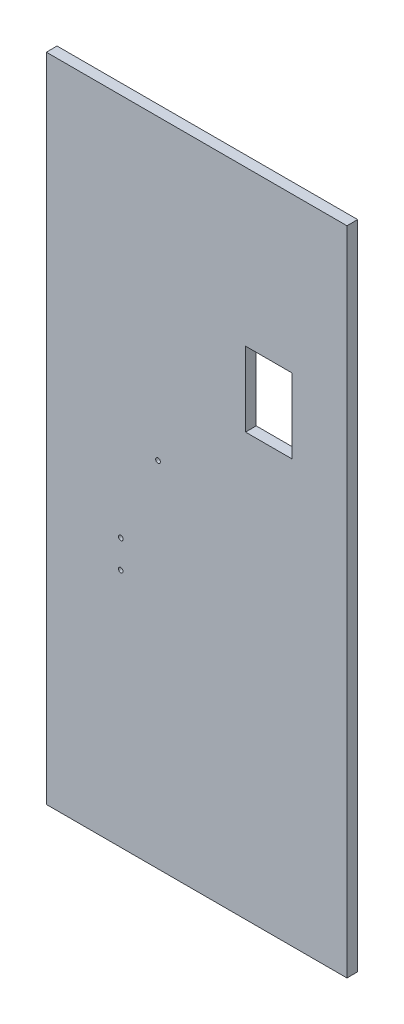
ISO-10303-21;
HEADER;
FILE_DESCRIPTION(('STEP AP214'),'2;1');
FILE_NAME('part.step','',(''),(''),'','','');
FILE_SCHEMA(('AUTOMOTIVE_DESIGN { 1 0 10303 214 1 1 1 1 }'));
ENDSEC;
DATA;
#1=APPLICATION_CONTEXT('core data for automotive mechanical design processes');
#2=APPLICATION_PROTOCOL_DEFINITION('international standard','automotive_design',2000,#1);
#3=PRODUCT_CONTEXT('',#1,'mechanical');
#4=PRODUCT('Part','Part','',(#3));
#5=PRODUCT_RELATED_PRODUCT_CATEGORY('part','',(#4));
#6=PRODUCT_DEFINITION_FORMATION('','',#4);
#7=PRODUCT_DEFINITION_CONTEXT('part definition',#1,'design');
#8=PRODUCT_DEFINITION('design','',#6,#7);
#9=PRODUCT_DEFINITION_SHAPE('','',#8);
#10=(LENGTH_UNIT() NAMED_UNIT(*) SI_UNIT(.MILLI.,.METRE.));
#11=(NAMED_UNIT(*) PLANE_ANGLE_UNIT() SI_UNIT($,.RADIAN.));
#12=(NAMED_UNIT(*) SI_UNIT($,.STERADIAN.) SOLID_ANGLE_UNIT());
#13=UNCERTAINTY_MEASURE_WITH_UNIT(LENGTH_MEASURE(1.E-05),#10,'distance_accuracy_value','');
#14=(GEOMETRIC_REPRESENTATION_CONTEXT(3) GLOBAL_UNCERTAINTY_ASSIGNED_CONTEXT((#13)) GLOBAL_UNIT_ASSIGNED_CONTEXT((#10,
#11,#12)) REPRESENTATION_CONTEXT('',''));
#15=CARTESIAN_POINT('',(0.,0.,0.));
#16=DIRECTION('',(0.,0.,1.));
#17=DIRECTION('',(1.,0.,0.));
#18=AXIS2_PLACEMENT_3D('',#15,#16,#17);
#19=CARTESIAN_POINT('',(0.,-350.,11.5));
#20=DIRECTION('',(0.,1.,0.));
#21=DIRECTION('',(-1.,0.,0.));
#22=AXIS2_PLACEMENT_3D('',#19,#20,#21);
#23=PLANE('',#22);
#24=DIRECTION('',(1.,0.,0.));
#25=VECTOR('',#24,1.);
#26=CARTESIAN_POINT('',(0.,-350.,0.));
#27=LINE('',#26,#25);
#28=CARTESIAN_POINT('',(-161.5,-350.,0.));
#29=VERTEX_POINT('',#28);
#30=CARTESIAN_POINT('',(161.5,-350.,0.));
#31=VERTEX_POINT('',#30);
#32=EDGE_CURVE('E150',#29,#31,#27,.T.);
#33=ORIENTED_EDGE('',*,*,#32,.T.);
#34=DIRECTION('',(0.,0.,-1.));
#35=VECTOR('',#34,1.);
#36=CARTESIAN_POINT('',(161.5,-350.,11.5));
#37=LINE('',#36,#35);
#38=CARTESIAN_POINT('',(161.5,-350.,11.5));
#39=VERTEX_POINT('',#38);
#40=EDGE_CURVE('E11',#39,#31,#37,.T.);
#41=ORIENTED_EDGE('',*,*,#40,.F.);
#42=DIRECTION('',(1.,0.,0.));
#43=VECTOR('',#42,1.);
#44=CARTESIAN_POINT('',(0.,-350.,11.5));
#45=LINE('',#44,#43);
#46=CARTESIAN_POINT('',(-161.5,-350.,11.5));
#47=VERTEX_POINT('',#46);
#48=EDGE_CURVE('E113',#47,#39,#45,.T.);
#49=ORIENTED_EDGE('',*,*,#48,.F.);
#50=DIRECTION('',(0.,0.,-1.));
#51=VECTOR('',#50,1.);
#52=CARTESIAN_POINT('',(-161.5,-350.,11.5));
#53=LINE('',#52,#51);
#54=EDGE_CURVE('E52',#47,#29,#53,.T.);
#55=ORIENTED_EDGE('',*,*,#54,.T.);
#56=EDGE_LOOP('',(#33,#41,#49,#55));
#57=FACE_BOUND('',#56,.T.);
#58=ADVANCED_FACE('F33',(#57),#23,.F.);
#59=CARTESIAN_POINT('',(161.5,0.,11.5));
#60=DIRECTION('',(-1.,0.,0.));
#61=DIRECTION('',(0.,0.,1.));
#62=AXIS2_PLACEMENT_3D('',#59,#60,#61);
#63=PLANE('',#62);
#64=DIRECTION('',(0.,1.,0.));
#65=VECTOR('',#64,1.);
#66=CARTESIAN_POINT('',(161.5,0.,0.));
#67=LINE('',#66,#65);
#68=CARTESIAN_POINT('',(161.5,350.,0.));
#69=VERTEX_POINT('',#68);
#70=EDGE_CURVE('E119',#31,#69,#67,.T.);
#71=ORIENTED_EDGE('',*,*,#70,.T.);
#72=DIRECTION('',(0.,0.,-1.));
#73=VECTOR('',#72,1.);
#74=CARTESIAN_POINT('',(161.5,350.,11.5));
#75=LINE('',#74,#73);
#76=CARTESIAN_POINT('',(161.5,350.,11.5));
#77=VERTEX_POINT('',#76);
#78=EDGE_CURVE('E43',#77,#69,#75,.T.);
#79=ORIENTED_EDGE('',*,*,#78,.F.);
#80=DIRECTION('',(0.,1.,0.));
#81=VECTOR('',#80,1.);
#82=CARTESIAN_POINT('',(161.5,0.,11.5));
#83=LINE('',#82,#81);
#84=EDGE_CURVE('E106',#39,#77,#83,.T.);
#85=ORIENTED_EDGE('',*,*,#84,.F.);
#86=ORIENTED_EDGE('',*,*,#40,.T.);
#87=EDGE_LOOP('',(#71,#79,#85,#86));
#88=FACE_BOUND('',#87,.T.);
#89=ADVANCED_FACE('F118',(#88),#63,.F.);
#90=CARTESIAN_POINT('',(0.,350.,11.5));
#91=DIRECTION('',(0.,1.,0.));
#92=DIRECTION('',(0.,0.,1.));
#93=AXIS2_PLACEMENT_3D('',#90,#91,#92);
#94=PLANE('',#93);
#95=DIRECTION('',(1.,0.,0.));
#96=VECTOR('',#95,1.);
#97=CARTESIAN_POINT('',(0.,350.,0.));
#98=LINE('',#97,#96);
#99=CARTESIAN_POINT('',(-161.5,350.,0.));
#100=VERTEX_POINT('',#99);
#101=EDGE_CURVE('E153',#100,#69,#98,.T.);
#102=ORIENTED_EDGE('',*,*,#101,.F.);
#103=DIRECTION('',(0.,0.,-1.));
#104=VECTOR('',#103,1.);
#105=CARTESIAN_POINT('',(-161.5,350.,11.5));
#106=LINE('',#105,#104);
#107=CARTESIAN_POINT('',(-161.5,350.,11.5));
#108=VERTEX_POINT('',#107);
#109=EDGE_CURVE('E78',#108,#100,#106,.T.);
#110=ORIENTED_EDGE('',*,*,#109,.F.);
#111=DIRECTION('',(1.,0.,0.));
#112=VECTOR('',#111,1.);
#113=CARTESIAN_POINT('',(0.,350.,11.5));
#114=LINE('',#113,#112);
#115=EDGE_CURVE('E112',#108,#77,#114,.T.);
#116=ORIENTED_EDGE('',*,*,#115,.T.);
#117=ORIENTED_EDGE('',*,*,#78,.T.);
#118=EDGE_LOOP('',(#102,#110,#116,#117));
#119=FACE_BOUND('',#118,.T.);
#120=ADVANCED_FACE('F123',(#119),#94,.T.);
#121=CARTESIAN_POINT('',(52.5,0.,11.5));
#122=DIRECTION('',(1.,0.,0.));
#123=DIRECTION('',(0.,0.,-1.));
#124=AXIS2_PLACEMENT_3D('',#121,#122,#123);
#125=PLANE('',#124);
#126=DIRECTION('',(0.,-1.,0.));
#127=VECTOR('',#126,1.);
#128=CARTESIAN_POINT('',(52.5,0.,0.));
#129=LINE('',#128,#127);
#130=CARTESIAN_POINT('',(52.5,183.5,0.));
#131=VERTEX_POINT('',#130);
#132=CARTESIAN_POINT('',(52.5,103.5,0.));
#133=VERTEX_POINT('',#132);
#134=EDGE_CURVE('E139',#131,#133,#129,.T.);
#135=ORIENTED_EDGE('',*,*,#134,.F.);
#136=DIRECTION('',(0.,0.,-1.));
#137=VECTOR('',#136,1.);
#138=CARTESIAN_POINT('',(52.5,183.5,11.5));
#139=LINE('',#138,#137);
#140=CARTESIAN_POINT('',(52.5,183.5,11.5));
#141=VERTEX_POINT('',#140);
#142=EDGE_CURVE('E37',#141,#131,#139,.T.);
#143=ORIENTED_EDGE('',*,*,#142,.F.);
#144=DIRECTION('',(0.,-1.,0.));
#145=VECTOR('',#144,1.);
#146=CARTESIAN_POINT('',(52.5,0.,11.5));
#147=LINE('',#146,#145);
#148=CARTESIAN_POINT('',(52.5,103.5,11.5));
#149=VERTEX_POINT('',#148);
#150=EDGE_CURVE('E167',#141,#149,#147,.T.);
#151=ORIENTED_EDGE('',*,*,#150,.T.);
#152=DIRECTION('',(0.,0.,-1.));
#153=VECTOR('',#152,1.);
#154=CARTESIAN_POINT('',(52.5,103.5,11.5));
#155=LINE('',#154,#153);
#156=EDGE_CURVE('E138',#149,#133,#155,.T.);
#157=ORIENTED_EDGE('',*,*,#156,.T.);
#158=EDGE_LOOP('',(#135,#143,#151,#157));
#159=FACE_BOUND('',#158,.T.);
#160=ADVANCED_FACE('F35',(#159),#125,.T.);
#161=CARTESIAN_POINT('',(0.,183.5,11.5));
#162=DIRECTION('',(0.,1.,0.));
#163=DIRECTION('',(0.,0.,1.));
#164=AXIS2_PLACEMENT_3D('',#161,#162,#163);
#165=PLANE('',#164);
#166=DIRECTION('',(1.,0.,0.));
#167=VECTOR('',#166,1.);
#168=CARTESIAN_POINT('',(0.,183.5,0.));
#169=LINE('',#168,#167);
#170=CARTESIAN_POINT('',(102.5,183.5,0.));
#171=VERTEX_POINT('',#170);
#172=EDGE_CURVE('E142',#131,#171,#169,.T.);
#173=ORIENTED_EDGE('',*,*,#172,.T.);
#174=DIRECTION('',(0.,0.,-1.));
#175=VECTOR('',#174,1.);
#176=CARTESIAN_POINT('',(102.5,183.5,11.5));
#177=LINE('',#176,#175);
#178=CARTESIAN_POINT('',(102.5,183.5,11.5));
#179=VERTEX_POINT('',#178);
#180=EDGE_CURVE('E172',#179,#171,#177,.T.);
#181=ORIENTED_EDGE('',*,*,#180,.F.);
#182=DIRECTION('',(1.,0.,0.));
#183=VECTOR('',#182,1.);
#184=CARTESIAN_POINT('',(0.,183.5,11.5));
#185=LINE('',#184,#183);
#186=EDGE_CURVE('E181',#141,#179,#185,.T.);
#187=ORIENTED_EDGE('',*,*,#186,.F.);
#188=ORIENTED_EDGE('',*,*,#142,.T.);
#189=EDGE_LOOP('',(#173,#181,#187,#188));
#190=FACE_BOUND('',#189,.T.);
#191=ADVANCED_FACE('F180',(#190),#165,.F.);
#192=CARTESIAN_POINT('',(102.5,0.,11.5));
#193=DIRECTION('',(1.,0.,0.));
#194=DIRECTION('',(0.,0.,-1.));
#195=AXIS2_PLACEMENT_3D('',#192,#193,#194);
#196=PLANE('',#195);
#197=DIRECTION('',(0.,-1.,0.));
#198=VECTOR('',#197,1.);
#199=CARTESIAN_POINT('',(102.5,0.,0.));
#200=LINE('',#199,#198);
#201=CARTESIAN_POINT('',(102.5,103.5,0.));
#202=VERTEX_POINT('',#201);
#203=EDGE_CURVE('E144',#171,#202,#200,.T.);
#204=ORIENTED_EDGE('',*,*,#203,.T.);
#205=DIRECTION('',(0.,0.,-1.));
#206=VECTOR('',#205,1.);
#207=CARTESIAN_POINT('',(102.5,103.5,11.5));
#208=LINE('',#207,#206);
#209=CARTESIAN_POINT('',(102.5,103.5,11.5));
#210=VERTEX_POINT('',#209);
#211=EDGE_CURVE('E171',#210,#202,#208,.T.);
#212=ORIENTED_EDGE('',*,*,#211,.F.);
#213=DIRECTION('',(0.,-1.,0.));
#214=VECTOR('',#213,1.);
#215=CARTESIAN_POINT('',(102.5,0.,11.5));
#216=LINE('',#215,#214);
#217=EDGE_CURVE('E301',#179,#210,#216,.T.);
#218=ORIENTED_EDGE('',*,*,#217,.F.);
#219=ORIENTED_EDGE('',*,*,#180,.T.);
#220=EDGE_LOOP('',(#204,#212,#218,#219));
#221=FACE_BOUND('',#220,.T.);
#222=ADVANCED_FACE('F193',(#221),#196,.F.);
#223=CARTESIAN_POINT('',(-81.5,-92.,11.5));
#224=DIRECTION('',(0.,0.,-1.));
#225=DIRECTION('',(-1.,0.,0.));
#226=AXIS2_PLACEMENT_3D('',#223,#224,#225);
#227=CYLINDRICAL_SURFACE('',#226,2.50000000000001);
#228=CARTESIAN_POINT('',(-81.5,-92.,11.5));
#229=DIRECTION('',(0.,0.,1.));
#230=DIRECTION('',(1.,0.,0.));
#231=AXIS2_PLACEMENT_3D('',#228,#229,#230);
#232=CIRCLE('',#231,2.50000000000001);
#233=CARTESIAN_POINT('',(-79.,-92.,11.5));
#234=VERTEX_POINT('',#233);
#235=EDGE_CURVE('E132',#234,#234,#232,.T.);
#236=ORIENTED_EDGE('',*,*,#235,.T.);
#237=EDGE_LOOP('',(#236));
#238=FACE_BOUND('',#237,.T.);
#239=CARTESIAN_POINT('',(-81.5,-92.,0.));
#240=DIRECTION('',(0.,0.,1.));
#241=DIRECTION('',(1.,0.,0.));
#242=AXIS2_PLACEMENT_3D('',#239,#240,#241);
#243=CIRCLE('',#242,2.50000000000001);
#244=CARTESIAN_POINT('',(-79.,-92.,0.));
#245=VERTEX_POINT('',#244);
#246=EDGE_CURVE('E161',#245,#245,#243,.T.);
#247=ORIENTED_EDGE('',*,*,#246,.F.);
#248=EDGE_LOOP('',(#247));
#249=FACE_BOUND('',#248,.T.);
#250=ADVANCED_FACE('F195',(#238,#249),#227,.F.);
#251=CARTESIAN_POINT('',(-81.5,-62.0000000000001,11.5));
#252=DIRECTION('',(0.,0.,-1.));
#253=DIRECTION('',(-1.,0.,0.));
#254=AXIS2_PLACEMENT_3D('',#251,#252,#253);
#255=CYLINDRICAL_SURFACE('',#254,2.5);
#256=CARTESIAN_POINT('',(-81.5,-62.0000000000001,11.5));
#257=DIRECTION('',(0.,0.,1.));
#258=DIRECTION('',(1.,0.,0.));
#259=AXIS2_PLACEMENT_3D('',#256,#257,#258);
#260=CIRCLE('',#259,2.5);
#261=CARTESIAN_POINT('',(-79.,-62.0000000000001,11.5));
#262=VERTEX_POINT('',#261);
#263=EDGE_CURVE('E126',#262,#262,#260,.T.);
#264=ORIENTED_EDGE('',*,*,#263,.T.);
#265=EDGE_LOOP('',(#264));
#266=FACE_BOUND('',#265,.T.);
#267=CARTESIAN_POINT('',(-81.5,-62.0000000000001,0.));
#268=DIRECTION('',(0.,0.,1.));
#269=DIRECTION('',(1.,0.,0.));
#270=AXIS2_PLACEMENT_3D('',#267,#268,#269);
#271=CIRCLE('',#270,2.5);
#272=CARTESIAN_POINT('',(-79.,-62.0000000000001,0.));
#273=VERTEX_POINT('',#272);
#274=EDGE_CURVE('E158',#273,#273,#271,.T.);
#275=ORIENTED_EDGE('',*,*,#274,.F.);
#276=EDGE_LOOP('',(#275));
#277=FACE_BOUND('',#276,.T.);
#278=ADVANCED_FACE('F201',(#266,#277),#255,.F.);
#279=CARTESIAN_POINT('',(-161.5,0.,11.5));
#280=DIRECTION('',(-1.,0.,0.));
#281=DIRECTION('',(0.,0.,1.));
#282=AXIS2_PLACEMENT_3D('',#279,#280,#281);
#283=PLANE('',#282);
#284=DIRECTION('',(0.,1.,0.));
#285=VECTOR('',#284,1.);
#286=CARTESIAN_POINT('',(-161.5,0.,0.));
#287=LINE('',#286,#285);
#288=EDGE_CURVE('E155',#29,#100,#287,.T.);
#289=ORIENTED_EDGE('',*,*,#288,.F.);
#290=ORIENTED_EDGE('',*,*,#54,.F.);
#291=DIRECTION('',(0.,1.,0.));
#292=VECTOR('',#291,1.);
#293=CARTESIAN_POINT('',(-161.5,0.,11.5));
#294=LINE('',#293,#292);
#295=EDGE_CURVE('E124',#47,#108,#294,.T.);
#296=ORIENTED_EDGE('',*,*,#295,.T.);
#297=ORIENTED_EDGE('',*,*,#109,.T.);
#298=EDGE_LOOP('',(#289,#290,#296,#297));
#299=FACE_BOUND('',#298,.T.);
#300=ADVANCED_FACE('F214',(#299),#283,.T.);
#301=CARTESIAN_POINT('',(0.,103.5,11.5));
#302=DIRECTION('',(0.,1.,0.));
#303=DIRECTION('',(0.,0.,1.));
#304=AXIS2_PLACEMENT_3D('',#301,#302,#303);
#305=PLANE('',#304);
#306=DIRECTION('',(1.,0.,0.));
#307=VECTOR('',#306,1.);
#308=CARTESIAN_POINT('',(0.,103.5,0.));
#309=LINE('',#308,#307);
#310=EDGE_CURVE('E147',#133,#202,#309,.T.);
#311=ORIENTED_EDGE('',*,*,#310,.F.);
#312=ORIENTED_EDGE('',*,*,#156,.F.);
#313=DIRECTION('',(1.,0.,0.));
#314=VECTOR('',#313,1.);
#315=CARTESIAN_POINT('',(0.,103.5,11.5));
#316=LINE('',#315,#314);
#317=EDGE_CURVE('E191',#149,#210,#316,.T.);
#318=ORIENTED_EDGE('',*,*,#317,.T.);
#319=ORIENTED_EDGE('',*,*,#211,.T.);
#320=EDGE_LOOP('',(#311,#312,#318,#319));
#321=FACE_BOUND('',#320,.T.);
#322=ADVANCED_FACE('F190',(#321),#305,.T.);
#323=CARTESIAN_POINT('',(-41.5,30.,11.5));
#324=DIRECTION('',(0.,0.,-1.));
#325=DIRECTION('',(-1.,0.,0.));
#326=AXIS2_PLACEMENT_3D('',#323,#324,#325);
#327=CYLINDRICAL_SURFACE('',#326,2.49999999999999);
#328=CARTESIAN_POINT('',(-41.5,30.,11.5));
#329=DIRECTION('',(0.,0.,1.));
#330=DIRECTION('',(1.,0.,0.));
#331=AXIS2_PLACEMENT_3D('',#328,#329,#330);
#332=CIRCLE('',#331,2.49999999999999);
#333=CARTESIAN_POINT('',(-39.,30.,11.5));
#334=VERTEX_POINT('',#333);
#335=EDGE_CURVE('E135',#334,#334,#332,.T.);
#336=ORIENTED_EDGE('',*,*,#335,.T.);
#337=EDGE_LOOP('',(#336));
#338=FACE_BOUND('',#337,.T.);
#339=CARTESIAN_POINT('',(-41.5,30.,0.));
#340=DIRECTION('',(0.,0.,1.));
#341=DIRECTION('',(1.,0.,0.));
#342=AXIS2_PLACEMENT_3D('',#339,#340,#341);
#343=CIRCLE('',#342,2.49999999999999);
#344=CARTESIAN_POINT('',(-39.,30.,0.));
#345=VERTEX_POINT('',#344);
#346=EDGE_CURVE('E164',#345,#345,#343,.T.);
#347=ORIENTED_EDGE('',*,*,#346,.F.);
#348=EDGE_LOOP('',(#347));
#349=FACE_BOUND('',#348,.T.);
#350=ADVANCED_FACE('F213',(#338,#349),#327,.F.);
#351=CARTESIAN_POINT('',(0.,0.,11.5));
#352=DIRECTION('',(0.,0.,1.));
#353=DIRECTION('',(1.,0.,0.));
#354=AXIS2_PLACEMENT_3D('',#351,#352,#353);
#355=PLANE('',#354);
#356=ORIENTED_EDGE('',*,*,#150,.F.);
#357=ORIENTED_EDGE('',*,*,#186,.T.);
#358=ORIENTED_EDGE('',*,*,#217,.T.);
#359=ORIENTED_EDGE('',*,*,#317,.F.);
#360=EDGE_LOOP('',(#356,#357,#358,#359));
#361=FACE_BOUND('',#360,.T.);
#362=ORIENTED_EDGE('',*,*,#48,.T.);
#363=ORIENTED_EDGE('',*,*,#84,.T.);
#364=ORIENTED_EDGE('',*,*,#115,.F.);
#365=ORIENTED_EDGE('',*,*,#295,.F.);
#366=EDGE_LOOP('',(#362,#363,#364,#365));
#367=FACE_BOUND('',#366,.T.);
#368=ORIENTED_EDGE('',*,*,#263,.F.);
#369=EDGE_LOOP('',(#368));
#370=FACE_BOUND('',#369,.T.);
#371=ORIENTED_EDGE('',*,*,#235,.F.);
#372=EDGE_LOOP('',(#371));
#373=FACE_BOUND('',#372,.T.);
#374=ORIENTED_EDGE('',*,*,#335,.F.);
#375=EDGE_LOOP('',(#374));
#376=FACE_BOUND('',#375,.T.);
#377=ADVANCED_FACE('F108',(#361,#367,#370,#373,#376),#355,.T.);
#378=CARTESIAN_POINT('',(0.,0.,0.));
#379=DIRECTION('',(0.,0.,1.));
#380=DIRECTION('',(1.,0.,0.));
#381=AXIS2_PLACEMENT_3D('',#378,#379,#380);
#382=PLANE('',#381);
#383=ORIENTED_EDGE('',*,*,#134,.T.);
#384=ORIENTED_EDGE('',*,*,#310,.T.);
#385=ORIENTED_EDGE('',*,*,#203,.F.);
#386=ORIENTED_EDGE('',*,*,#172,.F.);
#387=EDGE_LOOP('',(#383,#384,#385,#386));
#388=FACE_BOUND('',#387,.T.);
#389=ORIENTED_EDGE('',*,*,#32,.F.);
#390=ORIENTED_EDGE('',*,*,#288,.T.);
#391=ORIENTED_EDGE('',*,*,#101,.T.);
#392=ORIENTED_EDGE('',*,*,#70,.F.);
#393=EDGE_LOOP('',(#389,#390,#391,#392));
#394=FACE_BOUND('',#393,.T.);
#395=ORIENTED_EDGE('',*,*,#274,.T.);
#396=EDGE_LOOP('',(#395));
#397=FACE_BOUND('',#396,.T.);
#398=ORIENTED_EDGE('',*,*,#246,.T.);
#399=EDGE_LOOP('',(#398));
#400=FACE_BOUND('',#399,.T.);
#401=ORIENTED_EDGE('',*,*,#346,.T.);
#402=EDGE_LOOP('',(#401));
#403=FACE_BOUND('',#402,.T.);
#404=ADVANCED_FACE('F184',(#388,#394,#397,#400,#403),#382,.F.);
#405=CLOSED_SHELL('',(#58,#89,#120,#160,#191,#222,#250,#278,#300,#322,#350,#377,#404));
#406=MANIFOLD_SOLID_BREP('B2',#405);
#407=ADVANCED_BREP_SHAPE_REPRESENTATION('',(#18,#406),#14);
#408=SHAPE_DEFINITION_REPRESENTATION(#9,#407);
ENDSEC;
END-ISO-10303-21;
